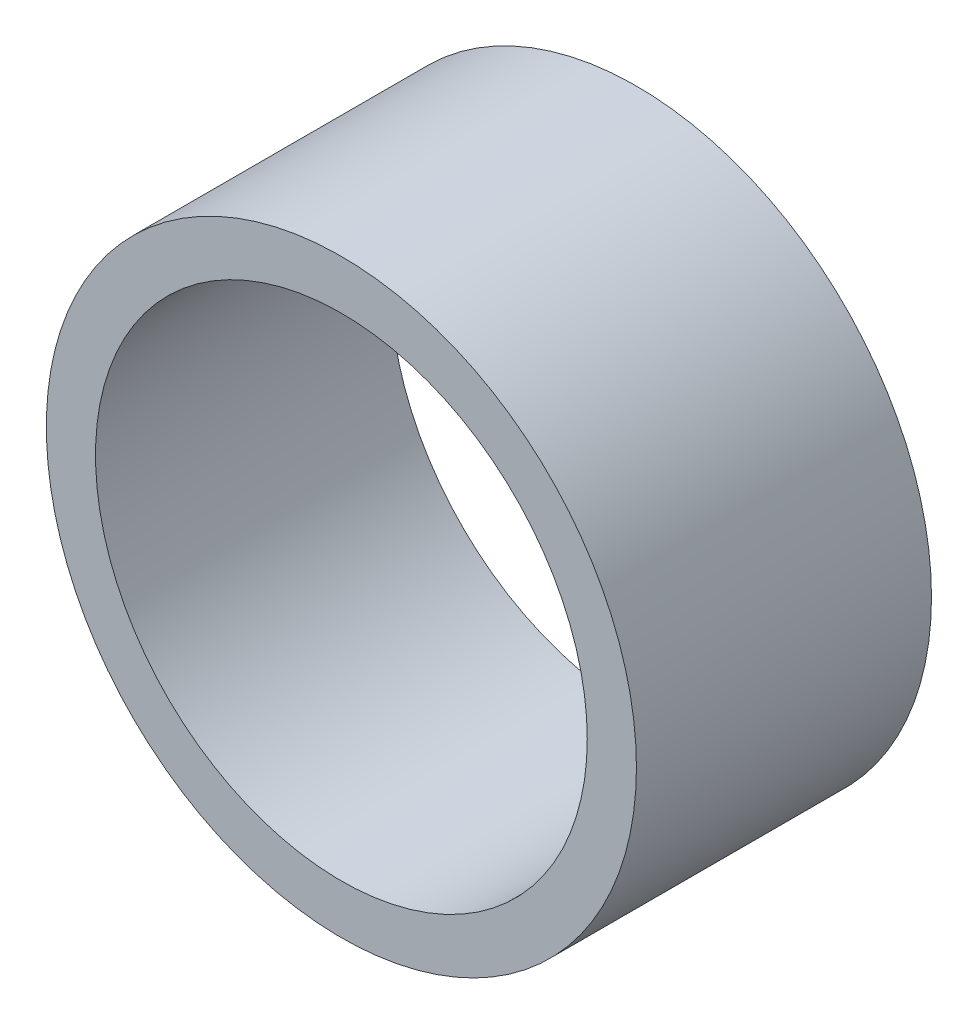
ISO-10303-21;
HEADER;
FILE_DESCRIPTION(('STEP AP214'),'2;1');
FILE_NAME('part.step','',(''),(''),'','','');
FILE_SCHEMA(('AUTOMOTIVE_DESIGN { 1 0 10303 214 1 1 1 1 }'));
ENDSEC;
DATA;
#1=APPLICATION_CONTEXT('core data for automotive mechanical design processes');
#2=APPLICATION_PROTOCOL_DEFINITION('international standard','automotive_design',2000,#1);
#3=PRODUCT_CONTEXT('',#1,'mechanical');
#4=PRODUCT('Part','Part','',(#3));
#5=PRODUCT_RELATED_PRODUCT_CATEGORY('part','',(#4));
#6=PRODUCT_DEFINITION_FORMATION('','',#4);
#7=PRODUCT_DEFINITION_CONTEXT('part definition',#1,'design');
#8=PRODUCT_DEFINITION('design','',#6,#7);
#9=PRODUCT_DEFINITION_SHAPE('','',#8);
#10=(LENGTH_UNIT() NAMED_UNIT(*) SI_UNIT(.MILLI.,.METRE.));
#11=(NAMED_UNIT(*) PLANE_ANGLE_UNIT() SI_UNIT($,.RADIAN.));
#12=(NAMED_UNIT(*) SI_UNIT($,.STERADIAN.) SOLID_ANGLE_UNIT());
#13=UNCERTAINTY_MEASURE_WITH_UNIT(LENGTH_MEASURE(1.E-05),#10,'distance_accuracy_value','');
#14=(GEOMETRIC_REPRESENTATION_CONTEXT(3) GLOBAL_UNCERTAINTY_ASSIGNED_CONTEXT((#13)) GLOBAL_UNIT_ASSIGNED_CONTEXT((#10,
#11,#12)) REPRESENTATION_CONTEXT('',''));
#15=CARTESIAN_POINT('',(0.,0.,0.));
#16=DIRECTION('',(0.,0.,1.));
#17=DIRECTION('',(1.,0.,0.));
#18=AXIS2_PLACEMENT_3D('',#15,#16,#17);
#19=CARTESIAN_POINT('',(0.,0.,6.));
#20=DIRECTION('',(0.,0.,1.));
#21=DIRECTION('',(1.,0.,0.));
#22=AXIS2_PLACEMENT_3D('',#19,#20,#21);
#23=PLANE('',#22);
#24=CARTESIAN_POINT('',(0.,0.,6.));
#25=DIRECTION('',(0.,0.,1.));
#26=DIRECTION('',(1.,0.,0.));
#27=AXIS2_PLACEMENT_3D('',#24,#25,#26);
#28=CIRCLE('',#27,6.);
#29=CARTESIAN_POINT('',(6.,0.,6.));
#30=VERTEX_POINT('',#29);
#31=EDGE_CURVE('E10',#30,#30,#28,.T.);
#32=ORIENTED_EDGE('',*,*,#31,.T.);
#33=EDGE_LOOP('',(#32));
#34=FACE_BOUND('',#33,.T.);
#35=CARTESIAN_POINT('',(0.,0.,6.));
#36=DIRECTION('',(0.,0.,1.));
#37=DIRECTION('',(1.,0.,0.));
#38=AXIS2_PLACEMENT_3D('',#35,#36,#37);
#39=CIRCLE('',#38,5.);
#40=CARTESIAN_POINT('',(5.,0.,6.));
#41=VERTEX_POINT('',#40);
#42=EDGE_CURVE('E50',#41,#41,#39,.T.);
#43=ORIENTED_EDGE('',*,*,#42,.F.);
#44=EDGE_LOOP('',(#43));
#45=FACE_BOUND('',#44,.T.);
#46=ADVANCED_FACE('F37',(#34,#45),#23,.T.);
#47=CARTESIAN_POINT('',(0.,0.,0.));
#48=DIRECTION('',(0.,0.,1.));
#49=DIRECTION('',(1.,0.,0.));
#50=AXIS2_PLACEMENT_3D('',#47,#48,#49);
#51=PLANE('',#50);
#52=CARTESIAN_POINT('',(0.,0.,0.));
#53=DIRECTION('',(0.,0.,1.));
#54=DIRECTION('',(1.,0.,0.));
#55=AXIS2_PLACEMENT_3D('',#52,#53,#54);
#56=CIRCLE('',#55,6.);
#57=CARTESIAN_POINT('',(6.,0.,0.));
#58=VERTEX_POINT('',#57);
#59=EDGE_CURVE('E41',#58,#58,#56,.T.);
#60=ORIENTED_EDGE('',*,*,#59,.F.);
#61=EDGE_LOOP('',(#60));
#62=FACE_BOUND('',#61,.T.);
#63=CARTESIAN_POINT('',(0.,0.,0.));
#64=DIRECTION('',(0.,0.,1.));
#65=DIRECTION('',(1.,0.,0.));
#66=AXIS2_PLACEMENT_3D('',#63,#64,#65);
#67=CIRCLE('',#66,5.);
#68=CARTESIAN_POINT('',(5.,0.,0.));
#69=VERTEX_POINT('',#68);
#70=EDGE_CURVE('E52',#69,#69,#67,.T.);
#71=ORIENTED_EDGE('',*,*,#70,.T.);
#72=EDGE_LOOP('',(#71));
#73=FACE_BOUND('',#72,.T.);
#74=ADVANCED_FACE('F64',(#62,#73),#51,.F.);
#75=CARTESIAN_POINT('',(0.,0.,6.));
#76=DIRECTION('',(0.,0.,-1.));
#77=DIRECTION('',(-1.,0.,0.));
#78=AXIS2_PLACEMENT_3D('',#75,#76,#77);
#79=CYLINDRICAL_SURFACE('',#78,6.);
#80=ORIENTED_EDGE('',*,*,#31,.F.);
#81=EDGE_LOOP('',(#80));
#82=FACE_BOUND('',#81,.T.);
#83=ORIENTED_EDGE('',*,*,#59,.T.);
#84=EDGE_LOOP('',(#83));
#85=FACE_BOUND('',#84,.T.);
#86=ADVANCED_FACE('F39',(#82,#85),#79,.T.);
#87=CARTESIAN_POINT('',(0.,0.,6.));
#88=DIRECTION('',(0.,0.,-1.));
#89=DIRECTION('',(-1.,0.,0.));
#90=AXIS2_PLACEMENT_3D('',#87,#88,#89);
#91=CYLINDRICAL_SURFACE('',#90,5.);
#92=ORIENTED_EDGE('',*,*,#42,.T.);
#93=EDGE_LOOP('',(#92));
#94=FACE_BOUND('',#93,.T.);
#95=ORIENTED_EDGE('',*,*,#70,.F.);
#96=EDGE_LOOP('',(#95));
#97=FACE_BOUND('',#96,.T.);
#98=ADVANCED_FACE('F60',(#94,#97),#91,.F.);
#99=CLOSED_SHELL('',(#46,#74,#86,#98));
#100=MANIFOLD_SOLID_BREP('B2',#99);
#101=ADVANCED_BREP_SHAPE_REPRESENTATION('',(#18,#100),#14);
#102=SHAPE_DEFINITION_REPRESENTATION(#9,#101);
ENDSEC;
END-ISO-10303-21;
